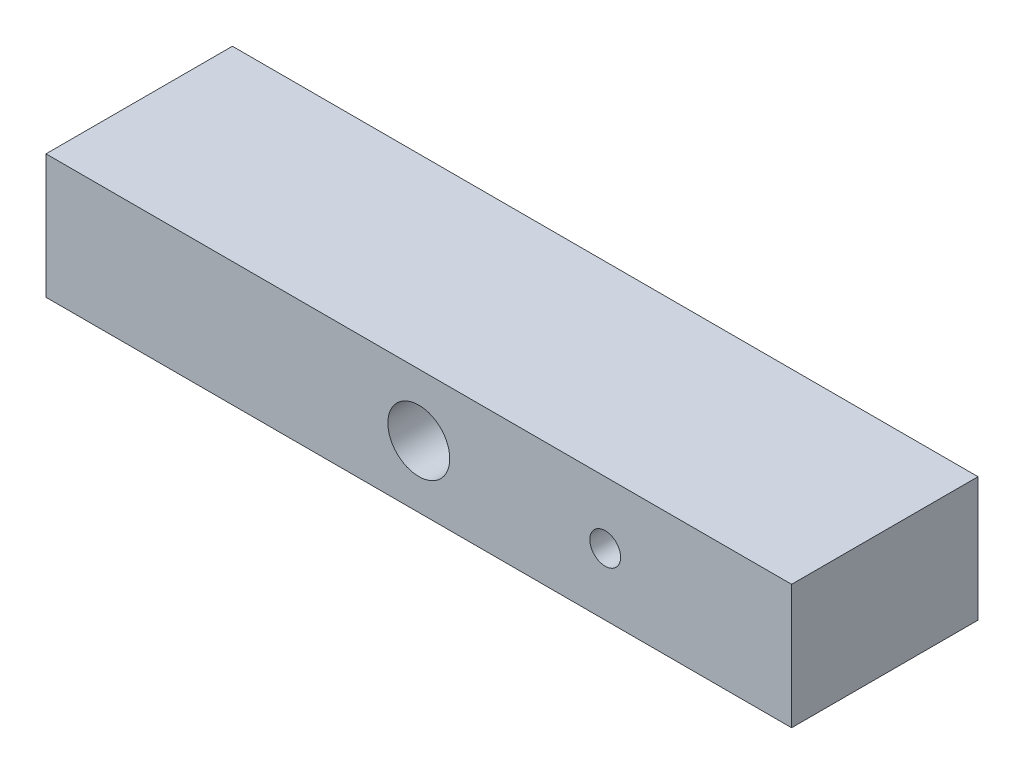
ISO-10303-21;
HEADER;
FILE_DESCRIPTION(('STEP AP214'),'2;1');
FILE_NAME('part.step','',(''),(''),'','','');
FILE_SCHEMA(('AUTOMOTIVE_DESIGN { 1 0 10303 214 1 1 1 1 }'));
ENDSEC;
DATA;
#1=APPLICATION_CONTEXT('core data for automotive mechanical design processes');
#2=APPLICATION_PROTOCOL_DEFINITION('international standard','automotive_design',2000,#1);
#3=PRODUCT_CONTEXT('',#1,'mechanical');
#4=PRODUCT('Part','Part','',(#3));
#5=PRODUCT_RELATED_PRODUCT_CATEGORY('part','',(#4));
#6=PRODUCT_DEFINITION_FORMATION('','',#4);
#7=PRODUCT_DEFINITION_CONTEXT('part definition',#1,'design');
#8=PRODUCT_DEFINITION('design','',#6,#7);
#9=PRODUCT_DEFINITION_SHAPE('','',#8);
#10=(LENGTH_UNIT() NAMED_UNIT(*) SI_UNIT(.MILLI.,.METRE.));
#11=(NAMED_UNIT(*) PLANE_ANGLE_UNIT() SI_UNIT($,.RADIAN.));
#12=(NAMED_UNIT(*) SI_UNIT($,.STERADIAN.) SOLID_ANGLE_UNIT());
#13=UNCERTAINTY_MEASURE_WITH_UNIT(LENGTH_MEASURE(1.E-05),#10,'distance_accuracy_value','');
#14=(GEOMETRIC_REPRESENTATION_CONTEXT(3) GLOBAL_UNCERTAINTY_ASSIGNED_CONTEXT((#13)) GLOBAL_UNIT_ASSIGNED_CONTEXT((#10,
#11,#12)) REPRESENTATION_CONTEXT('',''));
#15=CARTESIAN_POINT('',(0.,0.,0.));
#16=DIRECTION('',(0.,0.,1.));
#17=DIRECTION('',(1.,0.,0.));
#18=AXIS2_PLACEMENT_3D('',#15,#16,#17);
#19=CARTESIAN_POINT('',(-42.9025210084033,12.7,19.05));
#20=DIRECTION('',(1.,0.,0.));
#21=DIRECTION('',(0.,0.,-1.));
#22=AXIS2_PLACEMENT_3D('',#19,#20,#21);
#23=PLANE('',#22);
#24=DIRECTION('',(0.,-1.,0.));
#25=VECTOR('',#24,1.);
#26=CARTESIAN_POINT('',(-42.9025210084033,12.7,0.));
#27=LINE('',#26,#25);
#28=CARTESIAN_POINT('',(-42.9025210084033,12.7,0.));
#29=VERTEX_POINT('',#28);
#30=CARTESIAN_POINT('',(-42.9025210084033,0.,0.));
#31=VERTEX_POINT('',#30);
#32=EDGE_CURVE('E96',#29,#31,#27,.T.);
#33=ORIENTED_EDGE('',*,*,#32,.T.);
#34=DIRECTION('',(0.,0.,-1.));
#35=VECTOR('',#34,1.);
#36=CARTESIAN_POINT('',(-42.9025210084033,0.,19.05));
#37=LINE('',#36,#35);
#38=CARTESIAN_POINT('',(-42.9025210084033,0.,19.05));
#39=VERTEX_POINT('',#38);
#40=EDGE_CURVE('E11',#39,#31,#37,.T.);
#41=ORIENTED_EDGE('',*,*,#40,.F.);
#42=DIRECTION('',(0.,-1.,0.));
#43=VECTOR('',#42,1.);
#44=CARTESIAN_POINT('',(-42.9025210084033,12.7,19.05));
#45=LINE('',#44,#43);
#46=CARTESIAN_POINT('',(-42.9025210084033,12.7,19.05));
#47=VERTEX_POINT('',#46);
#48=EDGE_CURVE('E84',#47,#39,#45,.T.);
#49=ORIENTED_EDGE('',*,*,#48,.F.);
#50=DIRECTION('',(0.,0.,-1.));
#51=VECTOR('',#50,1.);
#52=CARTESIAN_POINT('',(-42.9025210084033,12.7,19.05));
#53=LINE('',#52,#51);
#54=EDGE_CURVE('E92',#47,#29,#53,.T.);
#55=ORIENTED_EDGE('',*,*,#54,.T.);
#56=EDGE_LOOP('',(#33,#41,#49,#55));
#57=FACE_BOUND('',#56,.T.);
#58=ADVANCED_FACE('F33',(#57),#23,.F.);
#59=CARTESIAN_POINT('',(-42.9025210084033,0.,19.05));
#60=DIRECTION('',(0.,1.,0.));
#61=DIRECTION('',(0.,0.,1.));
#62=AXIS2_PLACEMENT_3D('',#59,#60,#61);
#63=PLANE('',#62);
#64=DIRECTION('',(1.,0.,0.));
#65=VECTOR('',#64,1.);
#66=CARTESIAN_POINT('',(-42.9025210084033,0.,0.));
#67=LINE('',#66,#65);
#68=CARTESIAN_POINT('',(33.2974789915967,0.,0.));
#69=VERTEX_POINT('',#68);
#70=EDGE_CURVE('E88',#31,#69,#67,.T.);
#71=ORIENTED_EDGE('',*,*,#70,.T.);
#72=DIRECTION('',(0.,0.,-1.));
#73=VECTOR('',#72,1.);
#74=CARTESIAN_POINT('',(33.2974789915967,0.,19.05));
#75=LINE('',#74,#73);
#76=CARTESIAN_POINT('',(33.2974789915967,0.,19.05));
#77=VERTEX_POINT('',#76);
#78=EDGE_CURVE('E41',#77,#69,#75,.T.);
#79=ORIENTED_EDGE('',*,*,#78,.F.);
#80=DIRECTION('',(1.,0.,0.));
#81=VECTOR('',#80,1.);
#82=CARTESIAN_POINT('',(-42.9025210084033,0.,19.05));
#83=LINE('',#82,#81);
#84=EDGE_CURVE('E79',#39,#77,#83,.T.);
#85=ORIENTED_EDGE('',*,*,#84,.F.);
#86=ORIENTED_EDGE('',*,*,#40,.T.);
#87=EDGE_LOOP('',(#71,#79,#85,#86));
#88=FACE_BOUND('',#87,.T.);
#89=ADVANCED_FACE('F87',(#88),#63,.F.);
#90=CARTESIAN_POINT('',(33.2974789915967,12.7,19.05));
#91=DIRECTION('',(-1.,0.,0.));
#92=DIRECTION('',(0.,0.,1.));
#93=AXIS2_PLACEMENT_3D('',#90,#91,#92);
#94=PLANE('',#93);
#95=DIRECTION('',(0.,1.,0.));
#96=VECTOR('',#95,1.);
#97=CARTESIAN_POINT('',(33.2974789915967,12.7,0.));
#98=LINE('',#97,#96);
#99=CARTESIAN_POINT('',(33.2974789915967,12.7,0.));
#100=VERTEX_POINT('',#99);
#101=EDGE_CURVE('E66',#69,#100,#98,.T.);
#102=ORIENTED_EDGE('',*,*,#101,.T.);
#103=DIRECTION('',(0.,0.,-1.));
#104=VECTOR('',#103,1.);
#105=CARTESIAN_POINT('',(33.2974789915967,12.7,19.05));
#106=LINE('',#105,#104);
#107=CARTESIAN_POINT('',(33.2974789915967,12.7,19.05));
#108=VERTEX_POINT('',#107);
#109=EDGE_CURVE('E89',#108,#100,#106,.T.);
#110=ORIENTED_EDGE('',*,*,#109,.F.);
#111=DIRECTION('',(0.,1.,0.));
#112=VECTOR('',#111,1.);
#113=CARTESIAN_POINT('',(33.2974789915967,12.7,19.05));
#114=LINE('',#113,#112);
#115=EDGE_CURVE('E82',#77,#108,#114,.T.);
#116=ORIENTED_EDGE('',*,*,#115,.F.);
#117=ORIENTED_EDGE('',*,*,#78,.T.);
#118=EDGE_LOOP('',(#102,#110,#116,#117));
#119=FACE_BOUND('',#118,.T.);
#120=ADVANCED_FACE('F90',(#119),#94,.F.);
#121=CARTESIAN_POINT('',(-42.9025210084033,12.7,19.05));
#122=DIRECTION('',(0.,-1.,0.));
#123=DIRECTION('',(0.,0.,-1.));
#124=AXIS2_PLACEMENT_3D('',#121,#122,#123);
#125=PLANE('',#124);
#126=DIRECTION('',(-1.,0.,0.));
#127=VECTOR('',#126,1.);
#128=CARTESIAN_POINT('',(-42.9025210084033,12.7,0.));
#129=LINE('',#128,#127);
#130=EDGE_CURVE('E72',#100,#29,#129,.T.);
#131=ORIENTED_EDGE('',*,*,#130,.T.);
#132=ORIENTED_EDGE('',*,*,#54,.F.);
#133=DIRECTION('',(-1.,0.,0.));
#134=VECTOR('',#133,1.);
#135=CARTESIAN_POINT('',(-42.9025210084033,12.7,19.05));
#136=LINE('',#135,#134);
#137=EDGE_CURVE('E49',#108,#47,#136,.T.);
#138=ORIENTED_EDGE('',*,*,#137,.F.);
#139=ORIENTED_EDGE('',*,*,#109,.T.);
#140=EDGE_LOOP('',(#131,#132,#138,#139));
#141=FACE_BOUND('',#140,.T.);
#142=ADVANCED_FACE('F104',(#141),#125,.F.);
#143=CARTESIAN_POINT('',(0.,0.,19.05));
#144=DIRECTION('',(0.,0.,1.));
#145=DIRECTION('',(1.,0.,0.));
#146=AXIS2_PLACEMENT_3D('',#143,#144,#145);
#147=PLANE('',#146);
#148=CARTESIAN_POINT('',(14.2474789915967,6.34999999999999,19.05));
#149=DIRECTION('',(0.,0.,1.));
#150=DIRECTION('',(1.,0.,0.));
#151=AXIS2_PLACEMENT_3D('',#148,#149,#150);
#152=CIRCLE('',#151,1.5748);
#153=CARTESIAN_POINT('',(15.8222789915967,6.34999999999999,19.05));
#154=VERTEX_POINT('',#153);
#155=EDGE_CURVE('E116',#154,#154,#152,.T.);
#156=ORIENTED_EDGE('',*,*,#155,.F.);
#157=EDGE_LOOP('',(#156));
#158=FACE_BOUND('',#157,.T.);
#159=CARTESIAN_POINT('',(-4.80252100840334,6.34999999999999,19.05));
#160=DIRECTION('',(0.,0.,1.));
#161=DIRECTION('',(1.,0.,0.));
#162=AXIS2_PLACEMENT_3D('',#159,#160,#161);
#163=CIRCLE('',#162,3.1623);
#164=CARTESIAN_POINT('',(-1.64022100840334,6.34999999999999,19.05));
#165=VERTEX_POINT('',#164);
#166=EDGE_CURVE('E110',#165,#165,#163,.T.);
#167=ORIENTED_EDGE('',*,*,#166,.F.);
#168=EDGE_LOOP('',(#167));
#169=FACE_BOUND('',#168,.T.);
#170=ORIENTED_EDGE('',*,*,#48,.T.);
#171=ORIENTED_EDGE('',*,*,#84,.T.);
#172=ORIENTED_EDGE('',*,*,#115,.T.);
#173=ORIENTED_EDGE('',*,*,#137,.T.);
#174=EDGE_LOOP('',(#170,#171,#172,#173));
#175=FACE_BOUND('',#174,.T.);
#176=ADVANCED_FACE('F80',(#158,#169,#175),#147,.T.);
#177=CARTESIAN_POINT('',(0.,0.,0.));
#178=DIRECTION('',(0.,0.,1.));
#179=DIRECTION('',(1.,0.,0.));
#180=AXIS2_PLACEMENT_3D('',#177,#178,#179);
#181=PLANE('',#180);
#182=CARTESIAN_POINT('',(14.2474789915967,6.34999999999999,0.));
#183=DIRECTION('',(0.,0.,1.));
#184=DIRECTION('',(1.,0.,0.));
#185=AXIS2_PLACEMENT_3D('',#182,#183,#184);
#186=CIRCLE('',#185,1.5748);
#187=CARTESIAN_POINT('',(15.8222789915967,6.34999999999999,0.));
#188=VERTEX_POINT('',#187);
#189=EDGE_CURVE('E113',#188,#188,#186,.T.);
#190=ORIENTED_EDGE('',*,*,#189,.T.);
#191=EDGE_LOOP('',(#190));
#192=FACE_BOUND('',#191,.T.);
#193=CARTESIAN_POINT('',(-4.80252100840334,6.34999999999999,0.));
#194=DIRECTION('',(0.,0.,1.));
#195=DIRECTION('',(1.,0.,0.));
#196=AXIS2_PLACEMENT_3D('',#193,#194,#195);
#197=CIRCLE('',#196,3.1623);
#198=CARTESIAN_POINT('',(-1.64022100840334,6.34999999999999,0.));
#199=VERTEX_POINT('',#198);
#200=EDGE_CURVE('E99',#199,#199,#197,.T.);
#201=ORIENTED_EDGE('',*,*,#200,.T.);
#202=EDGE_LOOP('',(#201));
#203=FACE_BOUND('',#202,.T.);
#204=ORIENTED_EDGE('',*,*,#32,.F.);
#205=ORIENTED_EDGE('',*,*,#130,.F.);
#206=ORIENTED_EDGE('',*,*,#101,.F.);
#207=ORIENTED_EDGE('',*,*,#70,.F.);
#208=EDGE_LOOP('',(#204,#205,#206,#207));
#209=FACE_BOUND('',#208,.T.);
#210=ADVANCED_FACE('F107',(#192,#203,#209),#181,.F.);
#211=CARTESIAN_POINT('',(-4.80252100840334,6.34999999999999,0.));
#212=DIRECTION('',(0.,0.,1.));
#213=DIRECTION('',(1.,0.,0.));
#214=AXIS2_PLACEMENT_3D('',#211,#212,#213);
#215=CYLINDRICAL_SURFACE('',#214,3.1623);
#216=CARTESIAN_POINT('',(-1.64022100840334,6.34999999999999,0.));
#217=CARTESIAN_POINT('',(-1.64022100840334,6.34999999999999,0.1984375));
#218=CARTESIAN_POINT('',(-1.64022100840334,6.34999999999999,0.396875));
#219=CARTESIAN_POINT('',(-1.64022100840334,6.34999999999999,0.79375));
#220=CARTESIAN_POINT('',(-1.64022100840334,6.34999999999999,0.9921875));
#221=CARTESIAN_POINT('',(-1.64022100840334,6.34999999999999,1.3890625));
#222=CARTESIAN_POINT('',(-1.64022100840334,6.34999999999999,1.5875));
#223=CARTESIAN_POINT('',(-1.64022100840334,6.34999999999999,1.984375));
#224=CARTESIAN_POINT('',(-1.64022100840334,6.34999999999999,2.1828125));
#225=CARTESIAN_POINT('',(-1.64022100840334,6.34999999999999,2.5796875));
#226=CARTESIAN_POINT('',(-1.64022100840334,6.34999999999999,2.778125));
#227=CARTESIAN_POINT('',(-1.64022100840334,6.34999999999999,3.175));
#228=CARTESIAN_POINT('',(-1.64022100840334,6.34999999999999,3.3734375));
#229=CARTESIAN_POINT('',(-1.64022100840334,6.34999999999999,3.7703125));
#230=CARTESIAN_POINT('',(-1.64022100840334,6.34999999999999,3.96875));
#231=CARTESIAN_POINT('',(-1.64022100840334,6.34999999999999,4.365625));
#232=CARTESIAN_POINT('',(-1.64022100840334,6.34999999999999,4.5640625));
#233=CARTESIAN_POINT('',(-1.64022100840334,6.34999999999999,4.9609375));
#234=CARTESIAN_POINT('',(-1.64022100840334,6.34999999999999,5.159375));
#235=CARTESIAN_POINT('',(-1.64022100840334,6.34999999999999,5.55625));
#236=CARTESIAN_POINT('',(-1.64022100840334,6.34999999999999,5.7546875));
#237=CARTESIAN_POINT('',(-1.64022100840334,6.34999999999999,6.1515625));
#238=CARTESIAN_POINT('',(-1.64022100840334,6.34999999999999,6.35));
#239=CARTESIAN_POINT('',(-1.64022100840334,6.34999999999999,6.746875));
#240=CARTESIAN_POINT('',(-1.64022100840334,6.34999999999999,6.9453125));
#241=CARTESIAN_POINT('',(-1.64022100840334,6.34999999999999,7.3421875));
#242=CARTESIAN_POINT('',(-1.64022100840334,6.34999999999999,7.540625));
#243=CARTESIAN_POINT('',(-1.64022100840334,6.34999999999999,7.9375));
#244=CARTESIAN_POINT('',(-1.64022100840334,6.34999999999999,8.1359375));
#245=CARTESIAN_POINT('',(-1.64022100840334,6.34999999999999,8.5328125));
#246=CARTESIAN_POINT('',(-1.64022100840334,6.34999999999999,8.73125));
#247=CARTESIAN_POINT('',(-1.64022100840334,6.34999999999999,9.128125));
#248=CARTESIAN_POINT('',(-1.64022100840334,6.34999999999999,9.3265625));
#249=CARTESIAN_POINT('',(-1.64022100840334,6.34999999999999,9.7234375));
#250=CARTESIAN_POINT('',(-1.64022100840334,6.34999999999999,9.921875));
#251=CARTESIAN_POINT('',(-1.64022100840334,6.34999999999999,10.31875));
#252=CARTESIAN_POINT('',(-1.64022100840334,6.34999999999999,10.5171875));
#253=CARTESIAN_POINT('',(-1.64022100840334,6.34999999999999,10.9140625));
#254=CARTESIAN_POINT('',(-1.64022100840334,6.34999999999999,11.1125));
#255=CARTESIAN_POINT('',(-1.64022100840334,6.34999999999999,11.509375));
#256=CARTESIAN_POINT('',(-1.64022100840334,6.34999999999999,11.7078125));
#257=CARTESIAN_POINT('',(-1.64022100840334,6.34999999999999,12.1046875));
#258=CARTESIAN_POINT('',(-1.64022100840334,6.34999999999999,12.303125));
#259=CARTESIAN_POINT('',(-1.64022100840334,6.34999999999999,12.7));
#260=CARTESIAN_POINT('',(-1.64022100840334,6.34999999999999,12.8984375));
#261=CARTESIAN_POINT('',(-1.64022100840334,6.34999999999999,13.2953125));
#262=CARTESIAN_POINT('',(-1.64022100840334,6.34999999999999,13.49375));
#263=CARTESIAN_POINT('',(-1.64022100840334,6.34999999999999,13.890625));
#264=CARTESIAN_POINT('',(-1.64022100840334,6.34999999999999,14.0890625));
#265=CARTESIAN_POINT('',(-1.64022100840334,6.34999999999999,14.4859375));
#266=CARTESIAN_POINT('',(-1.64022100840334,6.34999999999999,14.684375));
#267=CARTESIAN_POINT('',(-1.64022100840334,6.34999999999999,15.08125));
#268=CARTESIAN_POINT('',(-1.64022100840334,6.34999999999999,15.2796875));
#269=CARTESIAN_POINT('',(-1.64022100840334,6.34999999999999,15.6765625));
#270=CARTESIAN_POINT('',(-1.64022100840334,6.34999999999999,15.875));
#271=CARTESIAN_POINT('',(-1.64022100840334,6.34999999999999,16.271875));
#272=CARTESIAN_POINT('',(-1.64022100840334,6.34999999999999,16.4703125));
#273=CARTESIAN_POINT('',(-1.64022100840334,6.34999999999999,16.8671875));
#274=CARTESIAN_POINT('',(-1.64022100840334,6.34999999999999,17.065625));
#275=CARTESIAN_POINT('',(-1.64022100840334,6.34999999999999,17.4625));
#276=CARTESIAN_POINT('',(-1.64022100840334,6.34999999999999,17.6609375));
#277=CARTESIAN_POINT('',(-1.64022100840334,6.34999999999999,18.0578125));
#278=CARTESIAN_POINT('',(-1.64022100840334,6.34999999999999,18.25625));
#279=CARTESIAN_POINT('',(-1.64022100840334,6.34999999999999,18.653125));
#280=CARTESIAN_POINT('',(-1.64022100840334,6.34999999999999,18.8515625));
#281=CARTESIAN_POINT('',(-1.64022100840334,6.34999999999999,19.05));
#282=B_SPLINE_CURVE_WITH_KNOTS('',3,(#216,#217,#218,#219,#220,#221,#222,#223,#224,#225,#226,
#227,#228,#229,#230,#231,#232,#233,#234,#235,#236,#237,#238,#239,#240,#241,#242,#243,#244,#245,
#246,#247,#248,#249,#250,#251,#252,#253,#254,#255,#256,#257,#258,#259,#260,#261,#262,#263,#264,
#265,#266,#267,#268,#269,#270,#271,#272,#273,#274,#275,#276,#277,#278,#279,#280,#281),
.UNSPECIFIED.,.F.,.F.,(4,2,2,2,2,2,2,2,2,2,2,2,2,2,2,2,2,2,2,2,2,2,2,2,2,2,2,2,2,2,2,2,4),(0.,
0.5953125,1.190625,1.7859375,2.38125,2.9765625,3.571875,4.1671875,4.7625,5.3578125,5.953125,
6.5484375,7.14375,7.7390625,8.334375,8.9296875,9.525,10.1203125,10.715625,11.3109375,11.90625,
12.5015625,13.096875,13.6921875,14.2875,14.8828125,15.478125,16.0734375,16.66875,17.2640625,
17.859375,18.4546875,19.05),.UNSPECIFIED.);
#283=EDGE_CURVE('BSEAM127',#199,#165,#282,.T.);
#284=ORIENTED_EDGE('',*,*,#200,.F.);
#285=ORIENTED_EDGE('',*,*,#166,.T.);
#286=ORIENTED_EDGE('',*,*,#283,.T.);
#287=ORIENTED_EDGE('',*,*,#283,.F.);
#288=EDGE_LOOP('',(#284,#286,#285,#287));
#289=FACE_BOUND('',#288,.T.);
#290=ADVANCED_FACE('F127',(#289),#215,.F.);
#291=CARTESIAN_POINT('',(14.2474789915967,6.34999999999999,0.));
#292=DIRECTION('',(0.,0.,1.));
#293=DIRECTION('',(1.,0.,0.));
#294=AXIS2_PLACEMENT_3D('',#291,#292,#293);
#295=CYLINDRICAL_SURFACE('',#294,1.5748);
#296=CARTESIAN_POINT('',(15.8222789915967,6.34999999999999,0.));
#297=CARTESIAN_POINT('',(15.8222789915967,6.34999999999999,0.1984375));
#298=CARTESIAN_POINT('',(15.8222789915967,6.34999999999999,0.396875));
#299=CARTESIAN_POINT('',(15.8222789915967,6.34999999999999,0.79375));
#300=CARTESIAN_POINT('',(15.8222789915967,6.34999999999999,0.9921875));
#301=CARTESIAN_POINT('',(15.8222789915967,6.34999999999999,1.3890625));
#302=CARTESIAN_POINT('',(15.8222789915967,6.34999999999999,1.5875));
#303=CARTESIAN_POINT('',(15.8222789915967,6.34999999999999,1.984375));
#304=CARTESIAN_POINT('',(15.8222789915967,6.34999999999999,2.1828125));
#305=CARTESIAN_POINT('',(15.8222789915967,6.34999999999999,2.5796875));
#306=CARTESIAN_POINT('',(15.8222789915967,6.34999999999999,2.778125));
#307=CARTESIAN_POINT('',(15.8222789915967,6.34999999999999,3.175));
#308=CARTESIAN_POINT('',(15.8222789915967,6.34999999999999,3.3734375));
#309=CARTESIAN_POINT('',(15.8222789915967,6.34999999999999,3.7703125));
#310=CARTESIAN_POINT('',(15.8222789915967,6.34999999999999,3.96875));
#311=CARTESIAN_POINT('',(15.8222789915967,6.34999999999999,4.365625));
#312=CARTESIAN_POINT('',(15.8222789915967,6.34999999999999,4.5640625));
#313=CARTESIAN_POINT('',(15.8222789915967,6.34999999999999,4.9609375));
#314=CARTESIAN_POINT('',(15.8222789915967,6.34999999999999,5.159375));
#315=CARTESIAN_POINT('',(15.8222789915967,6.34999999999999,5.55625));
#316=CARTESIAN_POINT('',(15.8222789915967,6.34999999999999,5.7546875));
#317=CARTESIAN_POINT('',(15.8222789915967,6.34999999999999,6.1515625));
#318=CARTESIAN_POINT('',(15.8222789915967,6.34999999999999,6.35));
#319=CARTESIAN_POINT('',(15.8222789915967,6.34999999999999,6.746875));
#320=CARTESIAN_POINT('',(15.8222789915967,6.34999999999999,6.9453125));
#321=CARTESIAN_POINT('',(15.8222789915967,6.34999999999999,7.3421875));
#322=CARTESIAN_POINT('',(15.8222789915967,6.34999999999999,7.540625));
#323=CARTESIAN_POINT('',(15.8222789915967,6.34999999999999,7.9375));
#324=CARTESIAN_POINT('',(15.8222789915967,6.34999999999999,8.1359375));
#325=CARTESIAN_POINT('',(15.8222789915967,6.34999999999999,8.5328125));
#326=CARTESIAN_POINT('',(15.8222789915967,6.34999999999999,8.73125));
#327=CARTESIAN_POINT('',(15.8222789915967,6.34999999999999,9.128125));
#328=CARTESIAN_POINT('',(15.8222789915967,6.34999999999999,9.3265625));
#329=CARTESIAN_POINT('',(15.8222789915967,6.34999999999999,9.7234375));
#330=CARTESIAN_POINT('',(15.8222789915967,6.34999999999999,9.921875));
#331=CARTESIAN_POINT('',(15.8222789915967,6.34999999999999,10.31875));
#332=CARTESIAN_POINT('',(15.8222789915967,6.34999999999999,10.5171875));
#333=CARTESIAN_POINT('',(15.8222789915967,6.34999999999999,10.9140625));
#334=CARTESIAN_POINT('',(15.8222789915967,6.34999999999999,11.1125));
#335=CARTESIAN_POINT('',(15.8222789915967,6.34999999999999,11.509375));
#336=CARTESIAN_POINT('',(15.8222789915967,6.34999999999999,11.7078125));
#337=CARTESIAN_POINT('',(15.8222789915967,6.34999999999999,12.1046875));
#338=CARTESIAN_POINT('',(15.8222789915967,6.34999999999999,12.303125));
#339=CARTESIAN_POINT('',(15.8222789915967,6.34999999999999,12.7));
#340=CARTESIAN_POINT('',(15.8222789915967,6.34999999999999,12.8984375));
#341=CARTESIAN_POINT('',(15.8222789915967,6.34999999999999,13.2953125));
#342=CARTESIAN_POINT('',(15.8222789915967,6.34999999999999,13.49375));
#343=CARTESIAN_POINT('',(15.8222789915967,6.34999999999999,13.890625));
#344=CARTESIAN_POINT('',(15.8222789915967,6.34999999999999,14.0890625));
#345=CARTESIAN_POINT('',(15.8222789915967,6.34999999999999,14.4859375));
#346=CARTESIAN_POINT('',(15.8222789915967,6.34999999999999,14.684375));
#347=CARTESIAN_POINT('',(15.8222789915967,6.34999999999999,15.08125));
#348=CARTESIAN_POINT('',(15.8222789915967,6.34999999999999,15.2796875));
#349=CARTESIAN_POINT('',(15.8222789915967,6.34999999999999,15.6765625));
#350=CARTESIAN_POINT('',(15.8222789915967,6.34999999999999,15.875));
#351=CARTESIAN_POINT('',(15.8222789915967,6.34999999999999,16.271875));
#352=CARTESIAN_POINT('',(15.8222789915967,6.34999999999999,16.4703125));
#353=CARTESIAN_POINT('',(15.8222789915967,6.34999999999999,16.8671875));
#354=CARTESIAN_POINT('',(15.8222789915967,6.34999999999999,17.065625));
#355=CARTESIAN_POINT('',(15.8222789915967,6.34999999999999,17.4625));
#356=CARTESIAN_POINT('',(15.8222789915967,6.34999999999999,17.6609375));
#357=CARTESIAN_POINT('',(15.8222789915967,6.34999999999999,18.0578125));
#358=CARTESIAN_POINT('',(15.8222789915967,6.34999999999999,18.25625));
#359=CARTESIAN_POINT('',(15.8222789915967,6.34999999999999,18.653125));
#360=CARTESIAN_POINT('',(15.8222789915967,6.34999999999999,18.8515625));
#361=CARTESIAN_POINT('',(15.8222789915967,6.34999999999999,19.05));
#362=B_SPLINE_CURVE_WITH_KNOTS('',3,(#296,#297,#298,#299,#300,#301,#302,#303,#304,#305,#306,
#307,#308,#309,#310,#311,#312,#313,#314,#315,#316,#317,#318,#319,#320,#321,#322,#323,#324,#325,
#326,#327,#328,#329,#330,#331,#332,#333,#334,#335,#336,#337,#338,#339,#340,#341,#342,#343,#344,
#345,#346,#347,#348,#349,#350,#351,#352,#353,#354,#355,#356,#357,#358,#359,#360,#361),
.UNSPECIFIED.,.F.,.F.,(4,2,2,2,2,2,2,2,2,2,2,2,2,2,2,2,2,2,2,2,2,2,2,2,2,2,2,2,2,2,2,2,4),(0.,
0.5953125,1.190625,1.7859375,2.38125,2.9765625,3.571875,4.1671875,4.7625,5.3578125,5.953125,
6.5484375,7.14375,7.7390625,8.334375,8.9296875,9.525,10.1203125,10.715625,11.3109375,11.90625,
12.5015625,13.096875,13.6921875,14.2875,14.8828125,15.478125,16.0734375,16.66875,17.2640625,
17.859375,18.4546875,19.05),.UNSPECIFIED.);
#363=EDGE_CURVE('BSEAM124',#188,#154,#362,.T.);
#364=ORIENTED_EDGE('',*,*,#189,.F.);
#365=ORIENTED_EDGE('',*,*,#155,.T.);
#366=ORIENTED_EDGE('',*,*,#363,.T.);
#367=ORIENTED_EDGE('',*,*,#363,.F.);
#368=EDGE_LOOP('',(#364,#366,#365,#367));
#369=FACE_BOUND('',#368,.T.);
#370=ADVANCED_FACE('F124',(#369),#295,.F.);
#371=CLOSED_SHELL('',(#58,#89,#120,#142,#176,#210,#290,#370));
#372=MANIFOLD_SOLID_BREP('B2',#371);
#373=ADVANCED_BREP_SHAPE_REPRESENTATION('',(#18,#372),#14);
#374=SHAPE_DEFINITION_REPRESENTATION(#9,#373);
ENDSEC;
END-ISO-10303-21;
